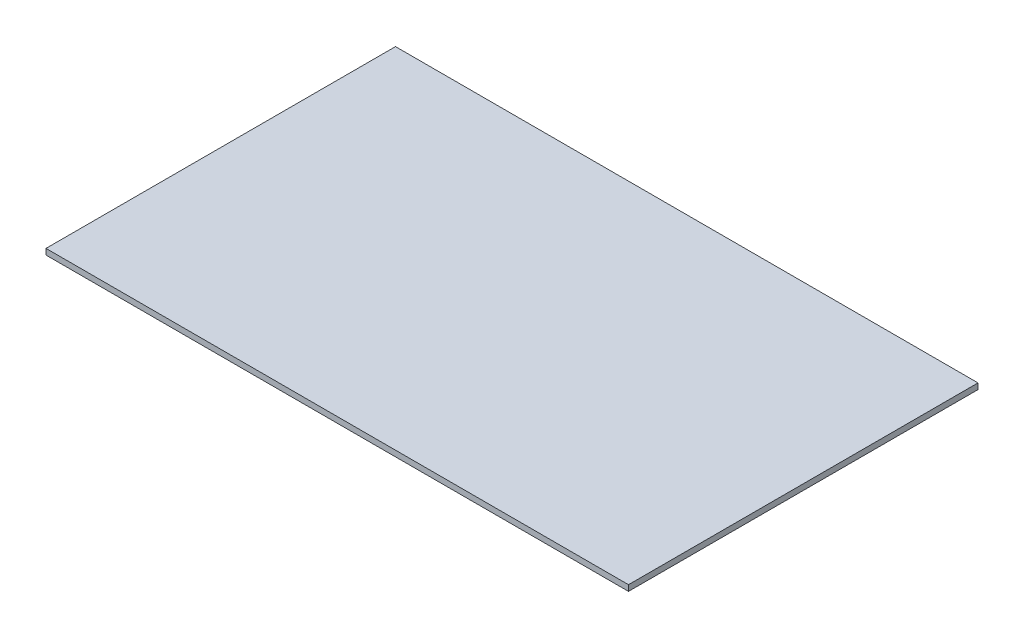
ISO-10303-21;
HEADER;
FILE_DESCRIPTION(('STEP AP214'),'2;1');
FILE_NAME('part.step','',(''),(''),'','','');
FILE_SCHEMA(('AUTOMOTIVE_DESIGN { 1 0 10303 214 1 1 1 1 }'));
ENDSEC;
DATA;
#1=APPLICATION_CONTEXT('core data for automotive mechanical design processes');
#2=APPLICATION_PROTOCOL_DEFINITION('international standard','automotive_design',2000,#1);
#3=PRODUCT_CONTEXT('',#1,'mechanical');
#4=PRODUCT('Part','Part','',(#3));
#5=PRODUCT_RELATED_PRODUCT_CATEGORY('part','',(#4));
#6=PRODUCT_DEFINITION_FORMATION('','',#4);
#7=PRODUCT_DEFINITION_CONTEXT('part definition',#1,'design');
#8=PRODUCT_DEFINITION('design','',#6,#7);
#9=PRODUCT_DEFINITION_SHAPE('','',#8);
#10=(LENGTH_UNIT() NAMED_UNIT(*) SI_UNIT(.MILLI.,.METRE.));
#11=(NAMED_UNIT(*) PLANE_ANGLE_UNIT() SI_UNIT($,.RADIAN.));
#12=(NAMED_UNIT(*) SI_UNIT($,.STERADIAN.) SOLID_ANGLE_UNIT());
#13=UNCERTAINTY_MEASURE_WITH_UNIT(LENGTH_MEASURE(1.E-05),#10,'distance_accuracy_value','');
#14=(GEOMETRIC_REPRESENTATION_CONTEXT(3) GLOBAL_UNCERTAINTY_ASSIGNED_CONTEXT((#13)) GLOBAL_UNIT_ASSIGNED_CONTEXT((#10,
#11,#12)) REPRESENTATION_CONTEXT('',''));
#15=CARTESIAN_POINT('',(0.,0.,0.));
#16=DIRECTION('',(0.,0.,1.));
#17=DIRECTION('',(1.,0.,0.));
#18=AXIS2_PLACEMENT_3D('',#15,#16,#17);
#19=CARTESIAN_POINT('',(250.,5.,-150.));
#20=DIRECTION('',(-1.,0.,0.));
#21=DIRECTION('',(0.,0.,1.));
#22=AXIS2_PLACEMENT_3D('',#19,#20,#21);
#23=PLANE('',#22);
#24=DIRECTION('',(0.,0.,-1.));
#25=VECTOR('',#24,1.);
#26=CARTESIAN_POINT('',(250.,0.,-150.));
#27=LINE('',#26,#25);
#28=CARTESIAN_POINT('',(250.,0.,150.));
#29=VERTEX_POINT('',#28);
#30=CARTESIAN_POINT('',(250.,0.,-150.));
#31=VERTEX_POINT('',#30);
#32=EDGE_CURVE('E107',#29,#31,#27,.T.);
#33=ORIENTED_EDGE('',*,*,#32,.T.);
#34=DIRECTION('',(0.,-1.,0.));
#35=VECTOR('',#34,1.);
#36=CARTESIAN_POINT('',(250.,5.,-150.));
#37=LINE('',#36,#35);
#38=CARTESIAN_POINT('',(250.,5.,-150.));
#39=VERTEX_POINT('',#38);
#40=EDGE_CURVE('E11',#39,#31,#37,.T.);
#41=ORIENTED_EDGE('',*,*,#40,.F.);
#42=DIRECTION('',(0.,0.,-1.));
#43=VECTOR('',#42,1.);
#44=CARTESIAN_POINT('',(250.,5.,-150.));
#45=LINE('',#44,#43);
#46=CARTESIAN_POINT('',(250.,5.,150.));
#47=VERTEX_POINT('',#46);
#48=EDGE_CURVE('E91',#47,#39,#45,.T.);
#49=ORIENTED_EDGE('',*,*,#48,.F.);
#50=DIRECTION('',(0.,-1.,0.));
#51=VECTOR('',#50,1.);
#52=CARTESIAN_POINT('',(250.,5.,150.));
#53=LINE('',#52,#51);
#54=EDGE_CURVE('E103',#47,#29,#53,.T.);
#55=ORIENTED_EDGE('',*,*,#54,.T.);
#56=EDGE_LOOP('',(#33,#41,#49,#55));
#57=FACE_BOUND('',#56,.T.);
#58=ADVANCED_FACE('F39',(#57),#23,.F.);
#59=CARTESIAN_POINT('',(-250.,5.,-150.));
#60=DIRECTION('',(0.,0.,1.));
#61=DIRECTION('',(1.,0.,0.));
#62=AXIS2_PLACEMENT_3D('',#59,#60,#61);
#63=PLANE('',#62);
#64=DIRECTION('',(-1.,0.,0.));
#65=VECTOR('',#64,1.);
#66=CARTESIAN_POINT('',(-250.,0.,-150.));
#67=LINE('',#66,#65);
#68=CARTESIAN_POINT('',(-250.,0.,-150.));
#69=VERTEX_POINT('',#68);
#70=EDGE_CURVE('E96',#31,#69,#67,.T.);
#71=ORIENTED_EDGE('',*,*,#70,.T.);
#72=DIRECTION('',(0.,-1.,0.));
#73=VECTOR('',#72,1.);
#74=CARTESIAN_POINT('',(-250.,5.,-150.));
#75=LINE('',#74,#73);
#76=CARTESIAN_POINT('',(-250.,5.,-150.));
#77=VERTEX_POINT('',#76);
#78=EDGE_CURVE('E48',#77,#69,#75,.T.);
#79=ORIENTED_EDGE('',*,*,#78,.F.);
#80=DIRECTION('',(-1.,0.,0.));
#81=VECTOR('',#80,1.);
#82=CARTESIAN_POINT('',(-250.,5.,-150.));
#83=LINE('',#82,#81);
#84=EDGE_CURVE('E86',#39,#77,#83,.T.);
#85=ORIENTED_EDGE('',*,*,#84,.F.);
#86=ORIENTED_EDGE('',*,*,#40,.T.);
#87=EDGE_LOOP('',(#71,#79,#85,#86));
#88=FACE_BOUND('',#87,.T.);
#89=ADVANCED_FACE('F95',(#88),#63,.F.);
#90=CARTESIAN_POINT('',(-250.,5.,-150.));
#91=DIRECTION('',(1.,0.,0.));
#92=DIRECTION('',(0.,0.,-1.));
#93=AXIS2_PLACEMENT_3D('',#90,#91,#92);
#94=PLANE('',#93);
#95=DIRECTION('',(0.,0.,1.));
#96=VECTOR('',#95,1.);
#97=CARTESIAN_POINT('',(-250.,0.,-150.));
#98=LINE('',#97,#96);
#99=CARTESIAN_POINT('',(-250.,0.,150.));
#100=VERTEX_POINT('',#99);
#101=EDGE_CURVE('E73',#69,#100,#98,.T.);
#102=ORIENTED_EDGE('',*,*,#101,.T.);
#103=DIRECTION('',(0.,-1.,0.));
#104=VECTOR('',#103,1.);
#105=CARTESIAN_POINT('',(-250.,5.,150.));
#106=LINE('',#105,#104);
#107=CARTESIAN_POINT('',(-250.,5.,150.));
#108=VERTEX_POINT('',#107);
#109=EDGE_CURVE('E98',#108,#100,#106,.T.);
#110=ORIENTED_EDGE('',*,*,#109,.F.);
#111=DIRECTION('',(0.,0.,1.));
#112=VECTOR('',#111,1.);
#113=CARTESIAN_POINT('',(-250.,5.,-150.));
#114=LINE('',#113,#112);
#115=EDGE_CURVE('E89',#77,#108,#114,.T.);
#116=ORIENTED_EDGE('',*,*,#115,.F.);
#117=ORIENTED_EDGE('',*,*,#78,.T.);
#118=EDGE_LOOP('',(#102,#110,#116,#117));
#119=FACE_BOUND('',#118,.T.);
#120=ADVANCED_FACE('F99',(#119),#94,.F.);
#121=CARTESIAN_POINT('',(-250.,5.,150.));
#122=DIRECTION('',(0.,0.,-1.));
#123=DIRECTION('',(-1.,0.,0.));
#124=AXIS2_PLACEMENT_3D('',#121,#122,#123);
#125=PLANE('',#124);
#126=DIRECTION('',(1.,0.,0.));
#127=VECTOR('',#126,1.);
#128=CARTESIAN_POINT('',(-250.,0.,150.));
#129=LINE('',#128,#127);
#130=EDGE_CURVE('E79',#100,#29,#129,.T.);
#131=ORIENTED_EDGE('',*,*,#130,.T.);
#132=ORIENTED_EDGE('',*,*,#54,.F.);
#133=DIRECTION('',(1.,0.,0.));
#134=VECTOR('',#133,1.);
#135=CARTESIAN_POINT('',(-250.,5.,150.));
#136=LINE('',#135,#134);
#137=EDGE_CURVE('E56',#108,#47,#136,.T.);
#138=ORIENTED_EDGE('',*,*,#137,.F.);
#139=ORIENTED_EDGE('',*,*,#109,.T.);
#140=EDGE_LOOP('',(#131,#132,#138,#139));
#141=FACE_BOUND('',#140,.T.);
#142=ADVANCED_FACE('F120',(#141),#125,.F.);
#143=CARTESIAN_POINT('',(0.,5.,0.));
#144=DIRECTION('',(0.,1.,0.));
#145=DIRECTION('',(0.,0.,1.));
#146=AXIS2_PLACEMENT_3D('',#143,#144,#145);
#147=PLANE('',#146);
#148=ORIENTED_EDGE('',*,*,#48,.T.);
#149=ORIENTED_EDGE('',*,*,#84,.T.);
#150=ORIENTED_EDGE('',*,*,#115,.T.);
#151=ORIENTED_EDGE('',*,*,#137,.T.);
#152=EDGE_LOOP('',(#148,#149,#150,#151));
#153=FACE_BOUND('',#152,.T.);
#154=ADVANCED_FACE('F87',(#153),#147,.T.);
#155=CARTESIAN_POINT('',(0.,0.,0.));
#156=DIRECTION('',(0.,1.,0.));
#157=DIRECTION('',(0.,0.,1.));
#158=AXIS2_PLACEMENT_3D('',#155,#156,#157);
#159=PLANE('',#158);
#160=ORIENTED_EDGE('',*,*,#32,.F.);
#161=ORIENTED_EDGE('',*,*,#130,.F.);
#162=ORIENTED_EDGE('',*,*,#101,.F.);
#163=ORIENTED_EDGE('',*,*,#70,.F.);
#164=EDGE_LOOP('',(#160,#161,#162,#163));
#165=FACE_BOUND('',#164,.T.);
#166=ADVANCED_FACE('F123',(#165),#159,.F.);
#167=CLOSED_SHELL('',(#58,#89,#120,#142,#154,#166));
#168=MANIFOLD_SOLID_BREP('B2',#167);
#169=ADVANCED_BREP_SHAPE_REPRESENTATION('',(#18,#168),#14);
#170=SHAPE_DEFINITION_REPRESENTATION(#9,#169);
ENDSEC;
END-ISO-10303-21;
